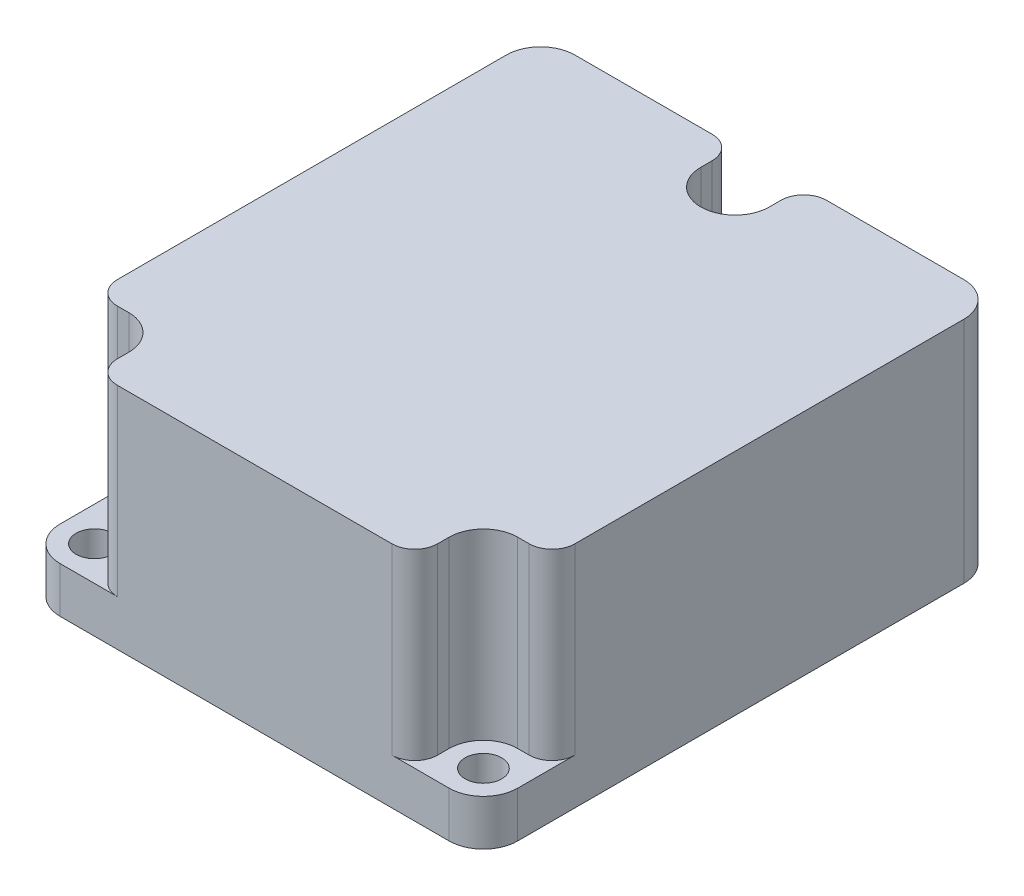
ISO-10303-21;
HEADER;
FILE_DESCRIPTION(('STEP AP214'),'2;1');
FILE_NAME('part.step','',(''),(''),'','','');
FILE_SCHEMA(('AUTOMOTIVE_DESIGN { 1 0 10303 214 1 1 1 1 }'));
ENDSEC;
DATA;
#1=APPLICATION_CONTEXT('core data for automotive mechanical design processes');
#2=APPLICATION_PROTOCOL_DEFINITION('international standard','automotive_design',2000,#1);
#3=PRODUCT_CONTEXT('',#1,'mechanical');
#4=PRODUCT('Part','Part','',(#3));
#5=PRODUCT_RELATED_PRODUCT_CATEGORY('part','',(#4));
#6=PRODUCT_DEFINITION_FORMATION('','',#4);
#7=PRODUCT_DEFINITION_CONTEXT('part definition',#1,'design');
#8=PRODUCT_DEFINITION('design','',#6,#7);
#9=PRODUCT_DEFINITION_SHAPE('','',#8);
#10=(LENGTH_UNIT() NAMED_UNIT(*) SI_UNIT(.MILLI.,.METRE.));
#11=(NAMED_UNIT(*) PLANE_ANGLE_UNIT() SI_UNIT($,.RADIAN.));
#12=(NAMED_UNIT(*) SI_UNIT($,.STERADIAN.) SOLID_ANGLE_UNIT());
#13=UNCERTAINTY_MEASURE_WITH_UNIT(LENGTH_MEASURE(1.E-05),#10,'distance_accuracy_value','');
#14=(GEOMETRIC_REPRESENTATION_CONTEXT(3) GLOBAL_UNCERTAINTY_ASSIGNED_CONTEXT((#13)) GLOBAL_UNIT_ASSIGNED_CONTEXT((#10,
#11,#12)) REPRESENTATION_CONTEXT('',''));
#15=CARTESIAN_POINT('',(0.,0.,0.));
#16=DIRECTION('',(0.,0.,1.));
#17=DIRECTION('',(1.,0.,0.));
#18=AXIS2_PLACEMENT_3D('',#15,#16,#17);
#19=CARTESIAN_POINT('',(3.00000000000001,20.,42.));
#20=DIRECTION('',(0.,1.,0.));
#21=DIRECTION('',(0.,0.,1.));
#22=AXIS2_PLACEMENT_3D('',#19,#20,#21);
#23=PLANE('',#22);
#24=DIRECTION('',(0.,0.,-1.));
#25=VECTOR('',#24,1.);
#26=CARTESIAN_POINT('',(17.,20.,0.));
#27=LINE('',#26,#25);
#28=CARTESIAN_POINT('',(17.,20.,3.));
#29=VERTEX_POINT('',#28);
#30=CARTESIAN_POINT('',(17.,20.,2.));
#31=VERTEX_POINT('',#30);
#32=EDGE_CURVE('E305',#29,#31,#27,.T.);
#33=ORIENTED_EDGE('',*,*,#32,.T.);
#34=CARTESIAN_POINT('',(15.,20.,2.));
#35=DIRECTION('',(0.,1.,0.));
#36=DIRECTION('',(0.,0.,1.));
#37=AXIS2_PLACEMENT_3D('',#34,#35,#36);
#38=CIRCLE('',#37,2.);
#39=CARTESIAN_POINT('',(15.,20.,0.));
#40=VERTEX_POINT('',#39);
#41=EDGE_CURVE('E392',#31,#40,#38,.T.);
#42=ORIENTED_EDGE('',*,*,#41,.T.);
#43=DIRECTION('',(-1.,0.,0.));
#44=VECTOR('',#43,1.);
#45=CARTESIAN_POINT('',(3.00000000000002,20.,0.));
#46=LINE('',#45,#44);
#47=CARTESIAN_POINT('',(3.00000000000002,20.,0.));
#48=VERTEX_POINT('',#47);
#49=EDGE_CURVE('E332',#40,#48,#46,.T.);
#50=ORIENTED_EDGE('',*,*,#49,.T.);
#51=CARTESIAN_POINT('',(3.,20.,3.));
#52=DIRECTION('',(0.,1.,0.));
#53=DIRECTION('',(0.,0.,1.));
#54=AXIS2_PLACEMENT_3D('',#51,#52,#53);
#55=CIRCLE('',#54,3.);
#56=CARTESIAN_POINT('',(0.,20.,3.00000000000002));
#57=VERTEX_POINT('',#56);
#58=EDGE_CURVE('E336',#48,#57,#55,.T.);
#59=ORIENTED_EDGE('',*,*,#58,.T.);
#60=DIRECTION('',(0.,0.,1.));
#61=VECTOR('',#60,1.);
#62=CARTESIAN_POINT('',(0.,20.,3.00000000000002));
#63=LINE('',#62,#61);
#64=CARTESIAN_POINT('',(0.,20.,37.));
#65=VERTEX_POINT('',#64);
#66=EDGE_CURVE('E338',#57,#65,#63,.T.);
#67=ORIENTED_EDGE('',*,*,#66,.T.);
#68=CARTESIAN_POINT('',(2.,20.,37.));
#69=DIRECTION('',(0.,1.,0.));
#70=DIRECTION('',(0.,0.,1.));
#71=AXIS2_PLACEMENT_3D('',#68,#69,#70);
#72=CIRCLE('',#71,2.);
#73=CARTESIAN_POINT('',(2.,20.,39.));
#74=VERTEX_POINT('',#73);
#75=EDGE_CURVE('E386',#65,#74,#72,.T.);
#76=ORIENTED_EDGE('',*,*,#75,.T.);
#77=DIRECTION('',(-1.,0.,0.));
#78=VECTOR('',#77,1.);
#79=CARTESIAN_POINT('',(0.,20.,39.));
#80=LINE('',#79,#78);
#81=CARTESIAN_POINT('',(3.00000000000001,20.,39.));
#82=VERTEX_POINT('',#81);
#83=EDGE_CURVE('E262',#82,#74,#80,.T.);
#84=ORIENTED_EDGE('',*,*,#83,.F.);
#85=CARTESIAN_POINT('',(3.00000000000001,20.,42.));
#86=DIRECTION('',(0.,1.,0.));
#87=DIRECTION('',(0.,0.,1.));
#88=AXIS2_PLACEMENT_3D('',#85,#86,#87);
#89=CIRCLE('',#88,3.);
#90=CARTESIAN_POINT('',(6.00000000000001,20.,42.));
#91=VERTEX_POINT('',#90);
#92=EDGE_CURVE('E281',#91,#82,#89,.T.);
#93=ORIENTED_EDGE('',*,*,#92,.F.);
#94=DIRECTION('',(0.,0.,1.));
#95=VECTOR('',#94,1.);
#96=CARTESIAN_POINT('',(6.00000000000001,20.,0.));
#97=LINE('',#96,#95);
#98=CARTESIAN_POINT('',(6.00000000000001,20.,43.));
#99=VERTEX_POINT('',#98);
#100=EDGE_CURVE('E278',#91,#99,#97,.T.);
#101=ORIENTED_EDGE('',*,*,#100,.T.);
#102=CARTESIAN_POINT('',(8.00000000000001,20.,43.));
#103=DIRECTION('',(0.,1.,0.));
#104=DIRECTION('',(0.,0.,1.));
#105=AXIS2_PLACEMENT_3D('',#102,#103,#104);
#106=CIRCLE('',#105,2.);
#107=CARTESIAN_POINT('',(8.00000000000001,20.,45.));
#108=VERTEX_POINT('',#107);
#109=EDGE_CURVE('E388',#99,#108,#106,.T.);
#110=ORIENTED_EDGE('',*,*,#109,.T.);
#111=DIRECTION('',(1.,0.,0.));
#112=VECTOR('',#111,1.);
#113=CARTESIAN_POINT('',(3.00000000000003,20.,45.));
#114=LINE('',#113,#112);
#115=CARTESIAN_POINT('',(32.,20.,45.));
#116=VERTEX_POINT('',#115);
#117=EDGE_CURVE('E324',#108,#116,#114,.T.);
#118=ORIENTED_EDGE('',*,*,#117,.T.);
#119=CARTESIAN_POINT('',(32.,20.,43.));
#120=DIRECTION('',(0.,1.,0.));
#121=DIRECTION('',(0.,0.,1.));
#122=AXIS2_PLACEMENT_3D('',#119,#120,#121);
#123=CIRCLE('',#122,2.);
#124=CARTESIAN_POINT('',(34.,20.,43.));
#125=VERTEX_POINT('',#124);
#126=EDGE_CURVE('E384',#116,#125,#123,.T.);
#127=ORIENTED_EDGE('',*,*,#126,.T.);
#128=DIRECTION('',(0.,0.,1.));
#129=VECTOR('',#128,1.);
#130=CARTESIAN_POINT('',(34.,20.,0.));
#131=LINE('',#130,#129);
#132=CARTESIAN_POINT('',(34.,20.,42.));
#133=VERTEX_POINT('',#132);
#134=EDGE_CURVE('E253',#133,#125,#131,.T.);
#135=ORIENTED_EDGE('',*,*,#134,.F.);
#136=CARTESIAN_POINT('',(37.,20.,42.));
#137=DIRECTION('',(0.,1.,0.));
#138=DIRECTION('',(0.,0.,1.));
#139=AXIS2_PLACEMENT_3D('',#136,#137,#138);
#140=CIRCLE('',#139,3.);
#141=CARTESIAN_POINT('',(37.,20.,39.));
#142=VERTEX_POINT('',#141);
#143=EDGE_CURVE('E250',#142,#133,#140,.T.);
#144=ORIENTED_EDGE('',*,*,#143,.F.);
#145=DIRECTION('',(1.,0.,0.));
#146=VECTOR('',#145,1.);
#147=CARTESIAN_POINT('',(0.,20.,39.));
#148=LINE('',#147,#146);
#149=CARTESIAN_POINT('',(38.,20.,39.));
#150=VERTEX_POINT('',#149);
#151=EDGE_CURVE('E224',#142,#150,#148,.T.);
#152=ORIENTED_EDGE('',*,*,#151,.T.);
#153=CARTESIAN_POINT('',(38.,20.,37.));
#154=DIRECTION('',(0.,1.,0.));
#155=DIRECTION('',(0.,0.,1.));
#156=AXIS2_PLACEMENT_3D('',#153,#154,#155);
#157=CIRCLE('',#156,2.);
#158=CARTESIAN_POINT('',(40.,20.,37.));
#159=VERTEX_POINT('',#158);
#160=EDGE_CURVE('E382',#150,#159,#157,.T.);
#161=ORIENTED_EDGE('',*,*,#160,.T.);
#162=DIRECTION('',(0.,0.,-1.));
#163=VECTOR('',#162,1.);
#164=CARTESIAN_POINT('',(40.,20.,3.00000000000002));
#165=LINE('',#164,#163);
#166=CARTESIAN_POINT('',(40.,20.,3.00000000000002));
#167=VERTEX_POINT('',#166);
#168=EDGE_CURVE('E327',#159,#167,#165,.T.);
#169=ORIENTED_EDGE('',*,*,#168,.T.);
#170=CARTESIAN_POINT('',(37.,20.,3.));
#171=DIRECTION('',(0.,1.,0.));
#172=DIRECTION('',(0.,0.,-1.));
#173=AXIS2_PLACEMENT_3D('',#170,#171,#172);
#174=CIRCLE('',#173,3.);
#175=CARTESIAN_POINT('',(37.,20.,0.));
#176=VERTEX_POINT('',#175);
#177=EDGE_CURVE('E330',#167,#176,#174,.T.);
#178=ORIENTED_EDGE('',*,*,#177,.T.);
#179=CARTESIAN_POINT('',(25.,20.,0.));
#180=VERTEX_POINT('',#179);
#181=EDGE_CURVE('E333',#176,#180,#46,.T.);
#182=ORIENTED_EDGE('',*,*,#181,.T.);
#183=CARTESIAN_POINT('',(25.,20.,2.));
#184=DIRECTION('',(0.,1.,0.));
#185=DIRECTION('',(0.,0.,1.));
#186=AXIS2_PLACEMENT_3D('',#183,#184,#185);
#187=CIRCLE('',#186,2.);
#188=CARTESIAN_POINT('',(23.,20.,2.));
#189=VERTEX_POINT('',#188);
#190=EDGE_CURVE('E390',#180,#189,#187,.T.);
#191=ORIENTED_EDGE('',*,*,#190,.T.);
#192=DIRECTION('',(0.,0.,-1.));
#193=VECTOR('',#192,1.);
#194=CARTESIAN_POINT('',(23.,20.,0.));
#195=LINE('',#194,#193);
#196=CARTESIAN_POINT('',(23.,20.,3.));
#197=VERTEX_POINT('',#196);
#198=EDGE_CURVE('E293',#197,#189,#195,.T.);
#199=ORIENTED_EDGE('',*,*,#198,.F.);
#200=CARTESIAN_POINT('',(20.,20.,3.));
#201=DIRECTION('',(0.,1.,0.));
#202=DIRECTION('',(0.,0.,1.));
#203=AXIS2_PLACEMENT_3D('',#200,#201,#202);
#204=CIRCLE('',#203,3.);
#205=EDGE_CURVE('E308',#29,#197,#204,.T.);
#206=ORIENTED_EDGE('',*,*,#205,.F.);
#207=EDGE_LOOP('',(#33,#42,#50,#59,#67,#76,#84,#93,#101,#110,#118,#127,#135,#144,#152,#161,#169,
#178,#182,#191,#199,#206));
#208=FACE_BOUND('',#207,.T.);
#209=ADVANCED_FACE('F48',(#208),#23,.T.);
#210=CARTESIAN_POINT('',(3.00000000000001,20.,42.));
#211=DIRECTION('',(0.,-1.,0.));
#212=DIRECTION('',(0.,0.,-1.));
#213=AXIS2_PLACEMENT_3D('',#210,#211,#212);
#214=CYLINDRICAL_SURFACE('',#213,3.);
#215=CARTESIAN_POINT('',(3.00000000000001,4.,42.));
#216=DIRECTION('',(0.,1.,0.));
#217=DIRECTION('',(0.,0.,1.));
#218=AXIS2_PLACEMENT_3D('',#215,#216,#217);
#219=CIRCLE('',#218,3.);
#220=CARTESIAN_POINT('',(0.,4.,42.));
#221=VERTEX_POINT('',#220);
#222=CARTESIAN_POINT('',(3.00000000000003,4.,45.));
#223=VERTEX_POINT('',#222);
#224=EDGE_CURVE('E273',#221,#223,#219,.T.);
#225=ORIENTED_EDGE('',*,*,#224,.F.);
#226=DIRECTION('',(0.,-1.,0.));
#227=VECTOR('',#226,1.);
#228=CARTESIAN_POINT('',(0.,20.,42.));
#229=LINE('',#228,#227);
#230=CARTESIAN_POINT('',(0.,0.,42.));
#231=VERTEX_POINT('',#230);
#232=EDGE_CURVE('E341',#221,#231,#229,.T.);
#233=ORIENTED_EDGE('',*,*,#232,.T.);
#234=CARTESIAN_POINT('',(3.00000000000001,0.,42.));
#235=DIRECTION('',(0.,1.,0.));
#236=DIRECTION('',(0.,0.,1.));
#237=AXIS2_PLACEMENT_3D('',#234,#235,#236);
#238=CIRCLE('',#237,3.);
#239=CARTESIAN_POINT('',(3.00000000000003,0.,45.));
#240=VERTEX_POINT('',#239);
#241=EDGE_CURVE('E323',#231,#240,#238,.T.);
#242=ORIENTED_EDGE('',*,*,#241,.T.);
#243=DIRECTION('',(0.,-1.,0.));
#244=VECTOR('',#243,1.);
#245=CARTESIAN_POINT('',(3.00000000000003,20.,45.));
#246=LINE('',#245,#244);
#247=EDGE_CURVE('E377',#223,#240,#246,.T.);
#248=ORIENTED_EDGE('',*,*,#247,.F.);
#249=EDGE_LOOP('',(#225,#233,#242,#248));
#250=FACE_BOUND('',#249,.T.);
#251=ADVANCED_FACE('F490',(#250),#214,.T.);
#252=CARTESIAN_POINT('',(3.00000000000003,20.,45.));
#253=DIRECTION('',(0.,0.,-1.));
#254=DIRECTION('',(-1.,0.,0.));
#255=AXIS2_PLACEMENT_3D('',#252,#253,#254);
#256=PLANE('',#255);
#257=ORIENTED_EDGE('',*,*,#117,.F.);
#258=DIRECTION('',(0.,1.,0.));
#259=VECTOR('',#258,1.);
#260=CARTESIAN_POINT('',(8.00000000000001,4.,45.));
#261=LINE('',#260,#259);
#262=CARTESIAN_POINT('',(8.00000000000001,4.,45.));
#263=VERTEX_POINT('',#262);
#264=EDGE_CURVE('E408',#108,#263,#261,.F.);
#265=ORIENTED_EDGE('',*,*,#264,.T.);
#266=DIRECTION('',(1.,0.,0.));
#267=VECTOR('',#266,1.);
#268=CARTESIAN_POINT('',(0.,4.,45.));
#269=LINE('',#268,#267);
#270=EDGE_CURVE('E275',#223,#263,#269,.T.);
#271=ORIENTED_EDGE('',*,*,#270,.F.);
#272=ORIENTED_EDGE('',*,*,#247,.T.);
#273=DIRECTION('',(1.,0.,0.));
#274=VECTOR('',#273,1.);
#275=CARTESIAN_POINT('',(3.00000000000003,0.,45.));
#276=LINE('',#275,#274);
#277=CARTESIAN_POINT('',(37.,0.,45.));
#278=VERTEX_POINT('',#277);
#279=EDGE_CURVE('E344',#240,#278,#276,.T.);
#280=ORIENTED_EDGE('',*,*,#279,.T.);
#281=DIRECTION('',(0.,-1.,0.));
#282=VECTOR('',#281,1.);
#283=CARTESIAN_POINT('',(37.,20.,45.));
#284=LINE('',#283,#282);
#285=CARTESIAN_POINT('',(37.,4.,45.));
#286=VERTEX_POINT('',#285);
#287=EDGE_CURVE('E375',#286,#278,#284,.T.);
#288=ORIENTED_EDGE('',*,*,#287,.F.);
#289=DIRECTION('',(1.,0.,0.));
#290=VECTOR('',#289,1.);
#291=CARTESIAN_POINT('',(0.,4.,45.));
#292=LINE('',#291,#290);
#293=CARTESIAN_POINT('',(32.,4.,45.));
#294=VERTEX_POINT('',#293);
#295=EDGE_CURVE('E241',#294,#286,#292,.T.);
#296=ORIENTED_EDGE('',*,*,#295,.F.);
#297=DIRECTION('',(0.,1.,0.));
#298=VECTOR('',#297,1.);
#299=CARTESIAN_POINT('',(32.,20.,45.));
#300=LINE('',#299,#298);
#301=EDGE_CURVE('E405',#294,#116,#300,.T.);
#302=ORIENTED_EDGE('',*,*,#301,.T.);
#303=EDGE_LOOP('',(#257,#265,#271,#272,#280,#288,#296,#302));
#304=FACE_BOUND('',#303,.T.);
#305=ADVANCED_FACE('F440',(#304),#256,.F.);
#306=CARTESIAN_POINT('',(37.,20.,42.));
#307=DIRECTION('',(0.,-1.,0.));
#308=DIRECTION('',(0.,0.,-1.));
#309=AXIS2_PLACEMENT_3D('',#306,#307,#308);
#310=CYLINDRICAL_SURFACE('',#309,3.);
#311=CARTESIAN_POINT('',(37.,4.,42.));
#312=DIRECTION('',(0.,1.,0.));
#313=DIRECTION('',(0.,0.,1.));
#314=AXIS2_PLACEMENT_3D('',#311,#312,#313);
#315=CIRCLE('',#314,3.);
#316=CARTESIAN_POINT('',(40.,4.,42.));
#317=VERTEX_POINT('',#316);
#318=EDGE_CURVE('E246',#286,#317,#315,.T.);
#319=ORIENTED_EDGE('',*,*,#318,.F.);
#320=ORIENTED_EDGE('',*,*,#287,.T.);
#321=CARTESIAN_POINT('',(37.,0.,42.));
#322=DIRECTION('',(0.,1.,0.));
#323=DIRECTION('',(0.,0.,1.));
#324=AXIS2_PLACEMENT_3D('',#321,#322,#323);
#325=CIRCLE('',#324,3.);
#326=CARTESIAN_POINT('',(40.,0.,42.));
#327=VERTEX_POINT('',#326);
#328=EDGE_CURVE('E347',#278,#327,#325,.T.);
#329=ORIENTED_EDGE('',*,*,#328,.T.);
#330=DIRECTION('',(0.,-1.,0.));
#331=VECTOR('',#330,1.);
#332=CARTESIAN_POINT('',(40.,20.,42.));
#333=LINE('',#332,#331);
#334=EDGE_CURVE('E373',#317,#327,#333,.T.);
#335=ORIENTED_EDGE('',*,*,#334,.F.);
#336=EDGE_LOOP('',(#319,#320,#329,#335));
#337=FACE_BOUND('',#336,.T.);
#338=ADVANCED_FACE('F496',(#337),#310,.T.);
#339=CARTESIAN_POINT('',(40.,20.,3.00000000000002));
#340=DIRECTION('',(-1.,0.,0.));
#341=DIRECTION('',(0.,0.,1.));
#342=AXIS2_PLACEMENT_3D('',#339,#340,#341);
#343=PLANE('',#342);
#344=ORIENTED_EDGE('',*,*,#168,.F.);
#345=DIRECTION('',(0.,1.,0.));
#346=VECTOR('',#345,1.);
#347=CARTESIAN_POINT('',(40.,4.,37.));
#348=LINE('',#347,#346);
#349=CARTESIAN_POINT('',(40.,4.,37.));
#350=VERTEX_POINT('',#349);
#351=EDGE_CURVE('E420',#159,#350,#348,.F.);
#352=ORIENTED_EDGE('',*,*,#351,.T.);
#353=DIRECTION('',(0.,0.,-1.));
#354=VECTOR('',#353,1.);
#355=CARTESIAN_POINT('',(40.,4.,0.));
#356=LINE('',#355,#354);
#357=EDGE_CURVE('E62',#317,#350,#356,.T.);
#358=ORIENTED_EDGE('',*,*,#357,.F.);
#359=ORIENTED_EDGE('',*,*,#334,.T.);
#360=DIRECTION('',(0.,0.,-1.));
#361=VECTOR('',#360,1.);
#362=CARTESIAN_POINT('',(40.,0.,3.00000000000002));
#363=LINE('',#362,#361);
#364=CARTESIAN_POINT('',(40.,0.,3.00000000000002));
#365=VERTEX_POINT('',#364);
#366=EDGE_CURVE('E350',#327,#365,#363,.T.);
#367=ORIENTED_EDGE('',*,*,#366,.T.);
#368=DIRECTION('',(0.,-1.,0.));
#369=VECTOR('',#368,1.);
#370=CARTESIAN_POINT('',(40.,20.,3.00000000000002));
#371=LINE('',#370,#369);
#372=EDGE_CURVE('E370',#167,#365,#371,.T.);
#373=ORIENTED_EDGE('',*,*,#372,.F.);
#374=EDGE_LOOP('',(#344,#352,#358,#359,#367,#373));
#375=FACE_BOUND('',#374,.T.);
#376=ADVANCED_FACE('F499',(#375),#343,.F.);
#377=CARTESIAN_POINT('',(3.00000000000002,20.,0.));
#378=DIRECTION('',(0.,0.,1.));
#379=DIRECTION('',(1.,0.,0.));
#380=AXIS2_PLACEMENT_3D('',#377,#378,#379);
#381=PLANE('',#380);
#382=ORIENTED_EDGE('',*,*,#49,.F.);
#383=DIRECTION('',(0.,1.,0.));
#384=VECTOR('',#383,1.);
#385=CARTESIAN_POINT('',(15.,4.,0.));
#386=LINE('',#385,#384);
#387=CARTESIAN_POINT('',(15.,4.,0.));
#388=VERTEX_POINT('',#387);
#389=EDGE_CURVE('E397',#40,#388,#386,.F.);
#390=ORIENTED_EDGE('',*,*,#389,.T.);
#391=DIRECTION('',(-1.,0.,0.));
#392=VECTOR('',#391,1.);
#393=CARTESIAN_POINT('',(0.,4.,0.));
#394=LINE('',#393,#392);
#395=CARTESIAN_POINT('',(25.,4.,0.));
#396=VERTEX_POINT('',#395);
#397=EDGE_CURVE('E302',#396,#388,#394,.T.);
#398=ORIENTED_EDGE('',*,*,#397,.F.);
#399=DIRECTION('',(0.,1.,0.));
#400=VECTOR('',#399,1.);
#401=CARTESIAN_POINT('',(25.,20.,0.));
#402=LINE('',#401,#400);
#403=EDGE_CURVE('E394',#396,#180,#402,.T.);
#404=ORIENTED_EDGE('',*,*,#403,.T.);
#405=ORIENTED_EDGE('',*,*,#181,.F.);
#406=DIRECTION('',(0.,-1.,0.));
#407=VECTOR('',#406,1.);
#408=CARTESIAN_POINT('',(37.,20.,0.));
#409=LINE('',#408,#407);
#410=CARTESIAN_POINT('',(37.,0.,0.));
#411=VERTEX_POINT('',#410);
#412=EDGE_CURVE('E367',#176,#411,#409,.T.);
#413=ORIENTED_EDGE('',*,*,#412,.T.);
#414=DIRECTION('',(-1.,0.,0.));
#415=VECTOR('',#414,1.);
#416=CARTESIAN_POINT('',(3.00000000000002,0.,0.));
#417=LINE('',#416,#415);
#418=CARTESIAN_POINT('',(3.00000000000002,0.,0.));
#419=VERTEX_POINT('',#418);
#420=EDGE_CURVE('E354',#411,#419,#417,.T.);
#421=ORIENTED_EDGE('',*,*,#420,.T.);
#422=DIRECTION('',(0.,-1.,0.));
#423=VECTOR('',#422,1.);
#424=CARTESIAN_POINT('',(3.00000000000002,20.,0.));
#425=LINE('',#424,#423);
#426=EDGE_CURVE('E364',#48,#419,#425,.T.);
#427=ORIENTED_EDGE('',*,*,#426,.F.);
#428=EDGE_LOOP('',(#382,#390,#398,#404,#405,#413,#421,#427));
#429=FACE_BOUND('',#428,.T.);
#430=ADVANCED_FACE('F532',(#429),#381,.F.);
#431=CARTESIAN_POINT('',(20.,20.,3.));
#432=DIRECTION('',(0.,-1.,0.));
#433=DIRECTION('',(0.,0.,-1.));
#434=AXIS2_PLACEMENT_3D('',#431,#432,#433);
#435=CYLINDRICAL_SURFACE('',#434,1.6);
#436=CARTESIAN_POINT('',(20.,0.,3.));
#437=DIRECTION('',(0.,1.,0.));
#438=DIRECTION('',(0.,0.,1.));
#439=AXIS2_PLACEMENT_3D('',#436,#437,#438);
#440=CIRCLE('',#439,1.6);
#441=CARTESIAN_POINT('',(20.,0.,4.6));
#442=VERTEX_POINT('',#441);
#443=EDGE_CURVE('E320',#442,#442,#440,.T.);
#444=ORIENTED_EDGE('',*,*,#443,.F.);
#445=EDGE_LOOP('',(#444));
#446=FACE_BOUND('',#445,.T.);
#447=CARTESIAN_POINT('',(20.,4.,3.));
#448=DIRECTION('',(0.,1.,0.));
#449=DIRECTION('',(0.,0.,1.));
#450=AXIS2_PLACEMENT_3D('',#447,#448,#449);
#451=CIRCLE('',#450,1.6);
#452=CARTESIAN_POINT('',(20.,4.,4.6));
#453=VERTEX_POINT('',#452);
#454=EDGE_CURVE('E289',#453,#453,#451,.F.);
#455=ORIENTED_EDGE('',*,*,#454,.F.);
#456=EDGE_LOOP('',(#455));
#457=FACE_BOUND('',#456,.T.);
#458=ADVANCED_FACE('F522',(#446,#457),#435,.F.);
#459=CARTESIAN_POINT('',(3.00000000000001,20.,42.));
#460=DIRECTION('',(0.,-1.,0.));
#461=DIRECTION('',(0.,0.,-1.));
#462=AXIS2_PLACEMENT_3D('',#459,#460,#461);
#463=CYLINDRICAL_SURFACE('',#462,1.6);
#464=CARTESIAN_POINT('',(3.00000000000001,0.,42.));
#465=DIRECTION('',(0.,1.,0.));
#466=DIRECTION('',(0.,0.,1.));
#467=AXIS2_PLACEMENT_3D('',#464,#465,#466);
#468=CIRCLE('',#467,1.6);
#469=CARTESIAN_POINT('',(3.00000000000001,0.,43.6));
#470=VERTEX_POINT('',#469);
#471=EDGE_CURVE('E317',#470,#470,#468,.T.);
#472=ORIENTED_EDGE('',*,*,#471,.F.);
#473=EDGE_LOOP('',(#472));
#474=FACE_BOUND('',#473,.T.);
#475=CARTESIAN_POINT('',(3.00000000000001,4.,42.));
#476=DIRECTION('',(0.,1.,0.));
#477=DIRECTION('',(0.,0.,1.));
#478=AXIS2_PLACEMENT_3D('',#475,#476,#477);
#479=CIRCLE('',#478,1.6);
#480=CARTESIAN_POINT('',(3.00000000000001,4.,43.6));
#481=VERTEX_POINT('',#480);
#482=EDGE_CURVE('E258',#481,#481,#479,.F.);
#483=ORIENTED_EDGE('',*,*,#482,.F.);
#484=EDGE_LOOP('',(#483));
#485=FACE_BOUND('',#484,.T.);
#486=ADVANCED_FACE('F714',(#474,#485),#463,.F.);
#487=CARTESIAN_POINT('',(37.,20.,42.));
#488=DIRECTION('',(0.,-1.,0.));
#489=DIRECTION('',(0.,0.,-1.));
#490=AXIS2_PLACEMENT_3D('',#487,#488,#489);
#491=CYLINDRICAL_SURFACE('',#490,1.6);
#492=CARTESIAN_POINT('',(37.,0.,42.));
#493=DIRECTION('',(0.,1.,0.));
#494=DIRECTION('',(0.,0.,1.));
#495=AXIS2_PLACEMENT_3D('',#492,#493,#494);
#496=CIRCLE('',#495,1.6);
#497=CARTESIAN_POINT('',(37.,0.,43.6));
#498=VERTEX_POINT('',#497);
#499=EDGE_CURVE('E256',#498,#498,#496,.T.);
#500=ORIENTED_EDGE('',*,*,#499,.F.);
#501=EDGE_LOOP('',(#500));
#502=FACE_BOUND('',#501,.T.);
#503=CARTESIAN_POINT('',(37.,4.,42.));
#504=DIRECTION('',(0.,1.,0.));
#505=DIRECTION('',(0.,0.,1.));
#506=AXIS2_PLACEMENT_3D('',#503,#504,#505);
#507=CIRCLE('',#506,1.6);
#508=CARTESIAN_POINT('',(37.,4.,43.6));
#509=VERTEX_POINT('',#508);
#510=EDGE_CURVE('E235',#509,#509,#507,.F.);
#511=ORIENTED_EDGE('',*,*,#510,.F.);
#512=EDGE_LOOP('',(#511));
#513=FACE_BOUND('',#512,.T.);
#514=ADVANCED_FACE('F527',(#502,#513),#491,.F.);
#515=CARTESIAN_POINT('',(3.00000000000001,0.,42.));
#516=DIRECTION('',(0.,1.,0.));
#517=DIRECTION('',(0.,0.,1.));
#518=AXIS2_PLACEMENT_3D('',#515,#516,#517);
#519=PLANE('',#518);
#520=ORIENTED_EDGE('',*,*,#241,.F.);
#521=DIRECTION('',(0.,0.,1.));
#522=VECTOR('',#521,1.);
#523=CARTESIAN_POINT('',(0.,0.,3.00000000000002));
#524=LINE('',#523,#522);
#525=CARTESIAN_POINT('',(0.,0.,3.00000000000002));
#526=VERTEX_POINT('',#525);
#527=EDGE_CURVE('E328',#526,#231,#524,.T.);
#528=ORIENTED_EDGE('',*,*,#527,.F.);
#529=CARTESIAN_POINT('',(3.,0.,3.));
#530=DIRECTION('',(0.,1.,0.));
#531=DIRECTION('',(0.,0.,1.));
#532=AXIS2_PLACEMENT_3D('',#529,#530,#531);
#533=CIRCLE('',#532,3.);
#534=EDGE_CURVE('E356',#419,#526,#533,.T.);
#535=ORIENTED_EDGE('',*,*,#534,.F.);
#536=ORIENTED_EDGE('',*,*,#420,.F.);
#537=CARTESIAN_POINT('',(37.,0.,3.));
#538=DIRECTION('',(0.,1.,0.));
#539=DIRECTION('',(0.,0.,-1.));
#540=AXIS2_PLACEMENT_3D('',#537,#538,#539);
#541=CIRCLE('',#540,3.);
#542=EDGE_CURVE('E352',#365,#411,#541,.T.);
#543=ORIENTED_EDGE('',*,*,#542,.F.);
#544=ORIENTED_EDGE('',*,*,#366,.F.);
#545=ORIENTED_EDGE('',*,*,#328,.F.);
#546=ORIENTED_EDGE('',*,*,#279,.F.);
#547=EDGE_LOOP('',(#520,#528,#535,#536,#543,#544,#545,#546));
#548=FACE_BOUND('',#547,.T.);
#549=ORIENTED_EDGE('',*,*,#443,.T.);
#550=EDGE_LOOP('',(#549));
#551=FACE_BOUND('',#550,.T.);
#552=ORIENTED_EDGE('',*,*,#471,.T.);
#553=EDGE_LOOP('',(#552));
#554=FACE_BOUND('',#553,.T.);
#555=ORIENTED_EDGE('',*,*,#499,.T.);
#556=EDGE_LOOP('',(#555));
#557=FACE_BOUND('',#556,.T.);
#558=ADVANCED_FACE('F482',(#548,#551,#554,#557),#519,.F.);
#559=CARTESIAN_POINT('',(37.,20.,3.));
#560=DIRECTION('',(0.,-1.,0.));
#561=DIRECTION('',(0.,0.,-1.));
#562=AXIS2_PLACEMENT_3D('',#559,#560,#561);
#563=CYLINDRICAL_SURFACE('',#562,3.);
#564=ORIENTED_EDGE('',*,*,#542,.T.);
#565=ORIENTED_EDGE('',*,*,#412,.F.);
#566=ORIENTED_EDGE('',*,*,#177,.F.);
#567=ORIENTED_EDGE('',*,*,#372,.T.);
#568=EDGE_LOOP('',(#564,#565,#566,#567));
#569=FACE_BOUND('',#568,.T.);
#570=ADVANCED_FACE('F526',(#569),#563,.T.);
#571=CARTESIAN_POINT('',(3.,20.,3.));
#572=DIRECTION('',(0.,-1.,0.));
#573=DIRECTION('',(0.,0.,-1.));
#574=AXIS2_PLACEMENT_3D('',#571,#572,#573);
#575=CYLINDRICAL_SURFACE('',#574,3.);
#576=ORIENTED_EDGE('',*,*,#534,.T.);
#577=DIRECTION('',(0.,-1.,0.));
#578=VECTOR('',#577,1.);
#579=CARTESIAN_POINT('',(0.,20.,3.00000000000002));
#580=LINE('',#579,#578);
#581=EDGE_CURVE('E361',#57,#526,#580,.T.);
#582=ORIENTED_EDGE('',*,*,#581,.F.);
#583=ORIENTED_EDGE('',*,*,#58,.F.);
#584=ORIENTED_EDGE('',*,*,#426,.T.);
#585=EDGE_LOOP('',(#576,#582,#583,#584));
#586=FACE_BOUND('',#585,.T.);
#587=ADVANCED_FACE('F477',(#586),#575,.T.);
#588=CARTESIAN_POINT('',(0.,20.,3.00000000000002));
#589=DIRECTION('',(1.,0.,0.));
#590=DIRECTION('',(0.,0.,-1.));
#591=AXIS2_PLACEMENT_3D('',#588,#589,#590);
#592=PLANE('',#591);
#593=DIRECTION('',(0.,0.,1.));
#594=VECTOR('',#593,1.);
#595=CARTESIAN_POINT('',(0.,4.,0.));
#596=LINE('',#595,#594);
#597=CARTESIAN_POINT('',(0.,4.,37.));
#598=VERTEX_POINT('',#597);
#599=EDGE_CURVE('E271',#598,#221,#596,.T.);
#600=ORIENTED_EDGE('',*,*,#599,.F.);
#601=DIRECTION('',(0.,1.,0.));
#602=VECTOR('',#601,1.);
#603=CARTESIAN_POINT('',(0.,20.,37.));
#604=LINE('',#603,#602);
#605=EDGE_CURVE('E411',#598,#65,#604,.T.);
#606=ORIENTED_EDGE('',*,*,#605,.T.);
#607=ORIENTED_EDGE('',*,*,#66,.F.);
#608=ORIENTED_EDGE('',*,*,#581,.T.);
#609=ORIENTED_EDGE('',*,*,#527,.T.);
#610=ORIENTED_EDGE('',*,*,#232,.F.);
#611=EDGE_LOOP('',(#600,#606,#607,#608,#609,#610));
#612=FACE_BOUND('',#611,.T.);
#613=ADVANCED_FACE('F470',(#612),#592,.F.);
#614=CARTESIAN_POINT('',(0.,4.,39.));
#615=DIRECTION('',(0.,0.,1.));
#616=DIRECTION('',(1.,0.,0.));
#617=AXIS2_PLACEMENT_3D('',#614,#615,#616);
#618=PLANE('',#617);
#619=DIRECTION('',(1.,0.,0.));
#620=VECTOR('',#619,1.);
#621=CARTESIAN_POINT('',(0.,4.,39.));
#622=LINE('',#621,#620);
#623=CARTESIAN_POINT('',(37.,4.,39.));
#624=VERTEX_POINT('',#623);
#625=CARTESIAN_POINT('',(38.,4.,39.));
#626=VERTEX_POINT('',#625);
#627=EDGE_CURVE('E221',#624,#626,#622,.T.);
#628=ORIENTED_EDGE('',*,*,#627,.T.);
#629=DIRECTION('',(0.,1.,0.));
#630=VECTOR('',#629,1.);
#631=CARTESIAN_POINT('',(38.,20.,39.));
#632=LINE('',#631,#630);
#633=EDGE_CURVE('E418',#626,#150,#632,.T.);
#634=ORIENTED_EDGE('',*,*,#633,.T.);
#635=ORIENTED_EDGE('',*,*,#151,.F.);
#636=DIRECTION('',(0.,1.,0.));
#637=VECTOR('',#636,1.);
#638=CARTESIAN_POINT('',(37.,4.,39.));
#639=LINE('',#638,#637);
#640=EDGE_CURVE('E218',#624,#142,#639,.T.);
#641=ORIENTED_EDGE('',*,*,#640,.F.);
#642=EDGE_LOOP('',(#628,#634,#635,#641));
#643=FACE_BOUND('',#642,.T.);
#644=ADVANCED_FACE('F219',(#643),#618,.T.);
#645=CARTESIAN_POINT('',(34.,4.,0.));
#646=DIRECTION('',(-1.,0.,0.));
#647=DIRECTION('',(0.,0.,1.));
#648=AXIS2_PLACEMENT_3D('',#645,#646,#647);
#649=PLANE('',#648);
#650=ORIENTED_EDGE('',*,*,#134,.T.);
#651=DIRECTION('',(0.,1.,0.));
#652=VECTOR('',#651,1.);
#653=CARTESIAN_POINT('',(34.,4.,43.));
#654=LINE('',#653,#652);
#655=CARTESIAN_POINT('',(34.,4.,43.));
#656=VERTEX_POINT('',#655);
#657=EDGE_CURVE('E416',#125,#656,#654,.F.);
#658=ORIENTED_EDGE('',*,*,#657,.T.);
#659=DIRECTION('',(0.,0.,1.));
#660=VECTOR('',#659,1.);
#661=CARTESIAN_POINT('',(34.,4.,0.));
#662=LINE('',#661,#660);
#663=CARTESIAN_POINT('',(34.,4.,42.));
#664=VERTEX_POINT('',#663);
#665=EDGE_CURVE('E239',#664,#656,#662,.T.);
#666=ORIENTED_EDGE('',*,*,#665,.F.);
#667=DIRECTION('',(0.,1.,0.));
#668=VECTOR('',#667,1.);
#669=CARTESIAN_POINT('',(34.,4.,42.));
#670=LINE('',#669,#668);
#671=EDGE_CURVE('E229',#664,#133,#670,.T.);
#672=ORIENTED_EDGE('',*,*,#671,.T.);
#673=EDGE_LOOP('',(#650,#658,#666,#672));
#674=FACE_BOUND('',#673,.T.);
#675=ADVANCED_FACE('F504',(#674),#649,.F.);
#676=CARTESIAN_POINT('',(37.,4.,42.));
#677=DIRECTION('',(0.,1.,0.));
#678=DIRECTION('',(0.,0.,1.));
#679=AXIS2_PLACEMENT_3D('',#676,#677,#678);
#680=CYLINDRICAL_SURFACE('',#679,3.);
#681=ORIENTED_EDGE('',*,*,#143,.T.);
#682=ORIENTED_EDGE('',*,*,#671,.F.);
#683=CARTESIAN_POINT('',(37.,4.,42.));
#684=DIRECTION('',(0.,1.,0.));
#685=DIRECTION('',(0.,0.,1.));
#686=AXIS2_PLACEMENT_3D('',#683,#684,#685);
#687=CIRCLE('',#686,3.);
#688=EDGE_CURVE('E234',#624,#664,#687,.T.);
#689=ORIENTED_EDGE('',*,*,#688,.F.);
#690=ORIENTED_EDGE('',*,*,#640,.T.);
#691=EDGE_LOOP('',(#681,#682,#689,#690));
#692=FACE_BOUND('',#691,.T.);
#693=ADVANCED_FACE('F237',(#692),#680,.F.);
#694=CARTESIAN_POINT('',(0.,4.,0.));
#695=DIRECTION('',(0.,1.,0.));
#696=DIRECTION('',(0.,0.,1.));
#697=AXIS2_PLACEMENT_3D('',#694,#695,#696);
#698=PLANE('',#697);
#699=ORIENTED_EDGE('',*,*,#510,.T.);
#700=EDGE_LOOP('',(#699));
#701=FACE_BOUND('',#700,.T.);
#702=ORIENTED_EDGE('',*,*,#627,.F.);
#703=ORIENTED_EDGE('',*,*,#688,.T.);
#704=ORIENTED_EDGE('',*,*,#665,.T.);
#705=CARTESIAN_POINT('',(32.,4.,43.));
#706=DIRECTION('',(0.,1.,0.));
#707=DIRECTION('',(0.,0.,1.));
#708=AXIS2_PLACEMENT_3D('',#705,#706,#707);
#709=CIRCLE('',#708,2.);
#710=EDGE_CURVE('E56',#656,#294,#709,.F.);
#711=ORIENTED_EDGE('',*,*,#710,.T.);
#712=ORIENTED_EDGE('',*,*,#295,.T.);
#713=ORIENTED_EDGE('',*,*,#318,.T.);
#714=ORIENTED_EDGE('',*,*,#357,.T.);
#715=CARTESIAN_POINT('',(38.,4.,37.));
#716=DIRECTION('',(0.,1.,0.));
#717=DIRECTION('',(0.,0.,1.));
#718=AXIS2_PLACEMENT_3D('',#715,#716,#717);
#719=CIRCLE('',#718,2.);
#720=EDGE_CURVE('E13',#350,#626,#719,.F.);
#721=ORIENTED_EDGE('',*,*,#720,.T.);
#722=EDGE_LOOP('',(#702,#703,#704,#711,#712,#713,#714,#721));
#723=FACE_BOUND('',#722,.T.);
#724=ADVANCED_FACE('F232',(#701,#723),#698,.T.);
#725=CARTESIAN_POINT('',(6.00000000000001,4.,0.));
#726=DIRECTION('',(-1.,0.,0.));
#727=DIRECTION('',(0.,0.,1.));
#728=AXIS2_PLACEMENT_3D('',#725,#726,#727);
#729=PLANE('',#728);
#730=DIRECTION('',(0.,0.,1.));
#731=VECTOR('',#730,1.);
#732=CARTESIAN_POINT('',(6.00000000000001,4.,0.));
#733=LINE('',#732,#731);
#734=CARTESIAN_POINT('',(6.00000000000001,4.,42.));
#735=VERTEX_POINT('',#734);
#736=CARTESIAN_POINT('',(6.00000000000001,4.,43.));
#737=VERTEX_POINT('',#736);
#738=EDGE_CURVE('E261',#735,#737,#733,.T.);
#739=ORIENTED_EDGE('',*,*,#738,.T.);
#740=DIRECTION('',(0.,1.,0.));
#741=VECTOR('',#740,1.);
#742=CARTESIAN_POINT('',(6.00000000000001,20.,43.));
#743=LINE('',#742,#741);
#744=EDGE_CURVE('E402',#737,#99,#743,.T.);
#745=ORIENTED_EDGE('',*,*,#744,.T.);
#746=ORIENTED_EDGE('',*,*,#100,.F.);
#747=DIRECTION('',(0.,1.,0.));
#748=VECTOR('',#747,1.);
#749=CARTESIAN_POINT('',(6.00000000000001,4.,42.));
#750=LINE('',#749,#748);
#751=EDGE_CURVE('E277',#735,#91,#750,.T.);
#752=ORIENTED_EDGE('',*,*,#751,.F.);
#753=EDGE_LOOP('',(#739,#745,#746,#752));
#754=FACE_BOUND('',#753,.T.);
#755=ADVANCED_FACE('F452',(#754),#729,.T.);
#756=CARTESIAN_POINT('',(0.,4.,39.));
#757=DIRECTION('',(0.,0.,-1.));
#758=DIRECTION('',(-1.,0.,0.));
#759=AXIS2_PLACEMENT_3D('',#756,#757,#758);
#760=PLANE('',#759);
#761=ORIENTED_EDGE('',*,*,#83,.T.);
#762=DIRECTION('',(0.,1.,0.));
#763=VECTOR('',#762,1.);
#764=CARTESIAN_POINT('',(2.,4.,39.));
#765=LINE('',#764,#763);
#766=CARTESIAN_POINT('',(2.,4.,39.));
#767=VERTEX_POINT('',#766);
#768=EDGE_CURVE('E414',#74,#767,#765,.F.);
#769=ORIENTED_EDGE('',*,*,#768,.T.);
#770=DIRECTION('',(-1.,0.,0.));
#771=VECTOR('',#770,1.);
#772=CARTESIAN_POINT('',(0.,4.,39.));
#773=LINE('',#772,#771);
#774=CARTESIAN_POINT('',(3.00000000000001,4.,39.));
#775=VERTEX_POINT('',#774);
#776=EDGE_CURVE('E268',#775,#767,#773,.T.);
#777=ORIENTED_EDGE('',*,*,#776,.F.);
#778=DIRECTION('',(0.,1.,0.));
#779=VECTOR('',#778,1.);
#780=CARTESIAN_POINT('',(3.00000000000001,4.,39.));
#781=LINE('',#780,#779);
#782=EDGE_CURVE('E251',#775,#82,#781,.T.);
#783=ORIENTED_EDGE('',*,*,#782,.T.);
#784=EDGE_LOOP('',(#761,#769,#777,#783));
#785=FACE_BOUND('',#784,.T.);
#786=ADVANCED_FACE('F462',(#785),#760,.F.);
#787=CARTESIAN_POINT('',(3.00000000000001,4.,42.));
#788=DIRECTION('',(0.,1.,0.));
#789=DIRECTION('',(0.,0.,1.));
#790=AXIS2_PLACEMENT_3D('',#787,#788,#789);
#791=CYLINDRICAL_SURFACE('',#790,3.);
#792=ORIENTED_EDGE('',*,*,#92,.T.);
#793=ORIENTED_EDGE('',*,*,#782,.F.);
#794=CARTESIAN_POINT('',(3.00000000000001,4.,42.));
#795=DIRECTION('',(0.,1.,0.));
#796=DIRECTION('',(0.,0.,1.));
#797=AXIS2_PLACEMENT_3D('',#794,#795,#796);
#798=CIRCLE('',#797,3.);
#799=EDGE_CURVE('E265',#735,#775,#798,.T.);
#800=ORIENTED_EDGE('',*,*,#799,.F.);
#801=ORIENTED_EDGE('',*,*,#751,.T.);
#802=EDGE_LOOP('',(#792,#793,#800,#801));
#803=FACE_BOUND('',#802,.T.);
#804=ADVANCED_FACE('F458',(#803),#791,.F.);
#805=CARTESIAN_POINT('',(0.,4.,0.));
#806=DIRECTION('',(0.,1.,0.));
#807=DIRECTION('',(0.,0.,1.));
#808=AXIS2_PLACEMENT_3D('',#805,#806,#807);
#809=PLANE('',#808);
#810=ORIENTED_EDGE('',*,*,#482,.T.);
#811=EDGE_LOOP('',(#810));
#812=FACE_BOUND('',#811,.T.);
#813=ORIENTED_EDGE('',*,*,#738,.F.);
#814=ORIENTED_EDGE('',*,*,#799,.T.);
#815=ORIENTED_EDGE('',*,*,#776,.T.);
#816=CARTESIAN_POINT('',(2.,4.,37.));
#817=DIRECTION('',(0.,1.,0.));
#818=DIRECTION('',(0.,0.,1.));
#819=AXIS2_PLACEMENT_3D('',#816,#817,#818);
#820=CIRCLE('',#819,2.);
#821=EDGE_CURVE('E429',#767,#598,#820,.F.);
#822=ORIENTED_EDGE('',*,*,#821,.T.);
#823=ORIENTED_EDGE('',*,*,#599,.T.);
#824=ORIENTED_EDGE('',*,*,#224,.T.);
#825=ORIENTED_EDGE('',*,*,#270,.T.);
#826=CARTESIAN_POINT('',(8.00000000000001,4.,43.));
#827=DIRECTION('',(0.,1.,0.));
#828=DIRECTION('',(0.,0.,1.));
#829=AXIS2_PLACEMENT_3D('',#826,#827,#828);
#830=CIRCLE('',#829,2.);
#831=EDGE_CURVE('E427',#263,#737,#830,.F.);
#832=ORIENTED_EDGE('',*,*,#831,.T.);
#833=EDGE_LOOP('',(#813,#814,#815,#822,#823,#824,#825,#832));
#834=FACE_BOUND('',#833,.T.);
#835=ADVANCED_FACE('F456',(#812,#834),#809,.T.);
#836=CARTESIAN_POINT('',(17.,4.,0.));
#837=DIRECTION('',(1.,0.,0.));
#838=DIRECTION('',(0.,0.,-1.));
#839=AXIS2_PLACEMENT_3D('',#836,#837,#838);
#840=PLANE('',#839);
#841=DIRECTION('',(0.,0.,-1.));
#842=VECTOR('',#841,1.);
#843=CARTESIAN_POINT('',(17.,4.,0.));
#844=LINE('',#843,#842);
#845=CARTESIAN_POINT('',(17.,4.,3.));
#846=VERTEX_POINT('',#845);
#847=CARTESIAN_POINT('',(17.,4.,2.));
#848=VERTEX_POINT('',#847);
#849=EDGE_CURVE('E292',#846,#848,#844,.T.);
#850=ORIENTED_EDGE('',*,*,#849,.T.);
#851=DIRECTION('',(0.,1.,0.));
#852=VECTOR('',#851,1.);
#853=CARTESIAN_POINT('',(17.,20.,2.));
#854=LINE('',#853,#852);
#855=EDGE_CURVE('E379',#848,#31,#854,.T.);
#856=ORIENTED_EDGE('',*,*,#855,.T.);
#857=ORIENTED_EDGE('',*,*,#32,.F.);
#858=DIRECTION('',(0.,1.,0.));
#859=VECTOR('',#858,1.);
#860=CARTESIAN_POINT('',(17.,4.,3.));
#861=LINE('',#860,#859);
#862=EDGE_CURVE('E304',#846,#29,#861,.T.);
#863=ORIENTED_EDGE('',*,*,#862,.F.);
#864=EDGE_LOOP('',(#850,#856,#857,#863));
#865=FACE_BOUND('',#864,.T.);
#866=ADVANCED_FACE('F627',(#865),#840,.T.);
#867=CARTESIAN_POINT('',(23.,4.,0.));
#868=DIRECTION('',(1.,0.,0.));
#869=DIRECTION('',(0.,0.,-1.));
#870=AXIS2_PLACEMENT_3D('',#867,#868,#869);
#871=PLANE('',#870);
#872=ORIENTED_EDGE('',*,*,#198,.T.);
#873=DIRECTION('',(0.,1.,0.));
#874=VECTOR('',#873,1.);
#875=CARTESIAN_POINT('',(23.,4.,2.));
#876=LINE('',#875,#874);
#877=CARTESIAN_POINT('',(23.,4.,2.));
#878=VERTEX_POINT('',#877);
#879=EDGE_CURVE('E400',#189,#878,#876,.F.);
#880=ORIENTED_EDGE('',*,*,#879,.T.);
#881=DIRECTION('',(0.,0.,-1.));
#882=VECTOR('',#881,1.);
#883=CARTESIAN_POINT('',(23.,4.,0.));
#884=LINE('',#883,#882);
#885=CARTESIAN_POINT('',(23.,4.,3.));
#886=VERTEX_POINT('',#885);
#887=EDGE_CURVE('E299',#886,#878,#884,.T.);
#888=ORIENTED_EDGE('',*,*,#887,.F.);
#889=DIRECTION('',(0.,1.,0.));
#890=VECTOR('',#889,1.);
#891=CARTESIAN_POINT('',(23.,4.,3.));
#892=LINE('',#891,#890);
#893=EDGE_CURVE('E282',#886,#197,#892,.T.);
#894=ORIENTED_EDGE('',*,*,#893,.T.);
#895=EDGE_LOOP('',(#872,#880,#888,#894));
#896=FACE_BOUND('',#895,.T.);
#897=ADVANCED_FACE('F618',(#896),#871,.F.);
#898=CARTESIAN_POINT('',(20.,4.,3.));
#899=DIRECTION('',(0.,1.,0.));
#900=DIRECTION('',(0.,0.,1.));
#901=AXIS2_PLACEMENT_3D('',#898,#899,#900);
#902=CYLINDRICAL_SURFACE('',#901,3.);
#903=ORIENTED_EDGE('',*,*,#205,.T.);
#904=ORIENTED_EDGE('',*,*,#893,.F.);
#905=CARTESIAN_POINT('',(20.,4.,3.));
#906=DIRECTION('',(0.,1.,0.));
#907=DIRECTION('',(0.,0.,1.));
#908=AXIS2_PLACEMENT_3D('',#905,#906,#907);
#909=CIRCLE('',#908,3.);
#910=EDGE_CURVE('E296',#846,#886,#909,.T.);
#911=ORIENTED_EDGE('',*,*,#910,.F.);
#912=ORIENTED_EDGE('',*,*,#862,.T.);
#913=EDGE_LOOP('',(#903,#904,#911,#912));
#914=FACE_BOUND('',#913,.T.);
#915=ADVANCED_FACE('F608',(#914),#902,.F.);
#916=CARTESIAN_POINT('',(0.,4.,0.));
#917=DIRECTION('',(0.,1.,0.));
#918=DIRECTION('',(0.,0.,1.));
#919=AXIS2_PLACEMENT_3D('',#916,#917,#918);
#920=PLANE('',#919);
#921=ORIENTED_EDGE('',*,*,#454,.T.);
#922=EDGE_LOOP('',(#921));
#923=FACE_BOUND('',#922,.T.);
#924=ORIENTED_EDGE('',*,*,#849,.F.);
#925=ORIENTED_EDGE('',*,*,#910,.T.);
#926=ORIENTED_EDGE('',*,*,#887,.T.);
#927=CARTESIAN_POINT('',(25.,4.,2.));
#928=DIRECTION('',(0.,1.,0.));
#929=DIRECTION('',(0.,0.,1.));
#930=AXIS2_PLACEMENT_3D('',#927,#928,#929);
#931=CIRCLE('',#930,2.);
#932=EDGE_CURVE('E424',#878,#396,#931,.F.);
#933=ORIENTED_EDGE('',*,*,#932,.T.);
#934=ORIENTED_EDGE('',*,*,#397,.T.);
#935=CARTESIAN_POINT('',(15.,4.,2.));
#936=DIRECTION('',(0.,1.,0.));
#937=DIRECTION('',(0.,0.,1.));
#938=AXIS2_PLACEMENT_3D('',#935,#936,#937);
#939=CIRCLE('',#938,2.);
#940=EDGE_CURVE('E422',#388,#848,#939,.F.);
#941=ORIENTED_EDGE('',*,*,#940,.T.);
#942=EDGE_LOOP('',(#924,#925,#926,#933,#934,#941));
#943=FACE_BOUND('',#942,.T.);
#944=ADVANCED_FACE('F549',(#923,#943),#920,.T.);
#945=CARTESIAN_POINT('',(15.,4.,2.));
#946=DIRECTION('',(0.,-1.,0.));
#947=DIRECTION('',(0.,0.,-1.));
#948=AXIS2_PLACEMENT_3D('',#945,#946,#947);
#949=CYLINDRICAL_SURFACE('',#948,2.);
#950=ORIENTED_EDGE('',*,*,#940,.F.);
#951=ORIENTED_EDGE('',*,*,#389,.F.);
#952=ORIENTED_EDGE('',*,*,#41,.F.);
#953=ORIENTED_EDGE('',*,*,#855,.F.);
#954=EDGE_LOOP('',(#950,#951,#952,#953));
#955=FACE_BOUND('',#954,.T.);
#956=ADVANCED_FACE('F545',(#955),#949,.T.);
#957=CARTESIAN_POINT('',(25.,20.,2.));
#958=DIRECTION('',(0.,1.,0.));
#959=DIRECTION('',(0.,0.,1.));
#960=AXIS2_PLACEMENT_3D('',#957,#958,#959);
#961=CYLINDRICAL_SURFACE('',#960,2.);
#962=ORIENTED_EDGE('',*,*,#932,.F.);
#963=ORIENTED_EDGE('',*,*,#879,.F.);
#964=ORIENTED_EDGE('',*,*,#190,.F.);
#965=ORIENTED_EDGE('',*,*,#403,.F.);
#966=EDGE_LOOP('',(#962,#963,#964,#965));
#967=FACE_BOUND('',#966,.T.);
#968=ADVANCED_FACE('F548',(#967),#961,.T.);
#969=CARTESIAN_POINT('',(8.00000000000001,4.,43.));
#970=DIRECTION('',(0.,-1.,0.));
#971=DIRECTION('',(0.,0.,-1.));
#972=AXIS2_PLACEMENT_3D('',#969,#970,#971);
#973=CYLINDRICAL_SURFACE('',#972,2.);
#974=ORIENTED_EDGE('',*,*,#831,.F.);
#975=ORIENTED_EDGE('',*,*,#264,.F.);
#976=ORIENTED_EDGE('',*,*,#109,.F.);
#977=ORIENTED_EDGE('',*,*,#744,.F.);
#978=EDGE_LOOP('',(#974,#975,#976,#977));
#979=FACE_BOUND('',#978,.T.);
#980=ADVANCED_FACE('F450',(#979),#973,.T.);
#981=CARTESIAN_POINT('',(2.,20.,37.));
#982=DIRECTION('',(0.,1.,0.));
#983=DIRECTION('',(0.,0.,1.));
#984=AXIS2_PLACEMENT_3D('',#981,#982,#983);
#985=CYLINDRICAL_SURFACE('',#984,2.);
#986=ORIENTED_EDGE('',*,*,#821,.F.);
#987=ORIENTED_EDGE('',*,*,#768,.F.);
#988=ORIENTED_EDGE('',*,*,#75,.F.);
#989=ORIENTED_EDGE('',*,*,#605,.F.);
#990=EDGE_LOOP('',(#986,#987,#988,#989));
#991=FACE_BOUND('',#990,.T.);
#992=ADVANCED_FACE('F467',(#991),#985,.T.);
#993=CARTESIAN_POINT('',(32.,20.,43.));
#994=DIRECTION('',(0.,1.,0.));
#995=DIRECTION('',(0.,0.,1.));
#996=AXIS2_PLACEMENT_3D('',#993,#994,#995);
#997=CYLINDRICAL_SURFACE('',#996,2.);
#998=ORIENTED_EDGE('',*,*,#710,.F.);
#999=ORIENTED_EDGE('',*,*,#657,.F.);
#1000=ORIENTED_EDGE('',*,*,#126,.F.);
#1001=ORIENTED_EDGE('',*,*,#301,.F.);
#1002=EDGE_LOOP('',(#998,#999,#1000,#1001));
#1003=FACE_BOUND('',#1002,.T.);
#1004=ADVANCED_FACE('F437',(#1003),#997,.T.);
#1005=CARTESIAN_POINT('',(38.,4.,37.));
#1006=DIRECTION('',(0.,-1.,0.));
#1007=DIRECTION('',(0.,0.,-1.));
#1008=AXIS2_PLACEMENT_3D('',#1005,#1006,#1007);
#1009=CYLINDRICAL_SURFACE('',#1008,2.);
#1010=ORIENTED_EDGE('',*,*,#720,.F.);
#1011=ORIENTED_EDGE('',*,*,#351,.F.);
#1012=ORIENTED_EDGE('',*,*,#160,.F.);
#1013=ORIENTED_EDGE('',*,*,#633,.F.);
#1014=EDGE_LOOP('',(#1010,#1011,#1012,#1013));
#1015=FACE_BOUND('',#1014,.T.);
#1016=ADVANCED_FACE('F50',(#1015),#1009,.T.);
#1017=CLOSED_SHELL('',(#209,#251,#305,#338,#376,#430,#458,#486,#514,#558,#570,#587,#613,#644,
#675,#693,#724,#755,#786,#804,#835,#866,#897,#915,#944,#956,#968,#980,#992,#1004,#1016));
#1018=MANIFOLD_SOLID_BREP('B2',#1017);
#1019=ADVANCED_BREP_SHAPE_REPRESENTATION('',(#18,#1018),#14);
#1020=SHAPE_DEFINITION_REPRESENTATION(#9,#1019);
ENDSEC;
END-ISO-10303-21;
